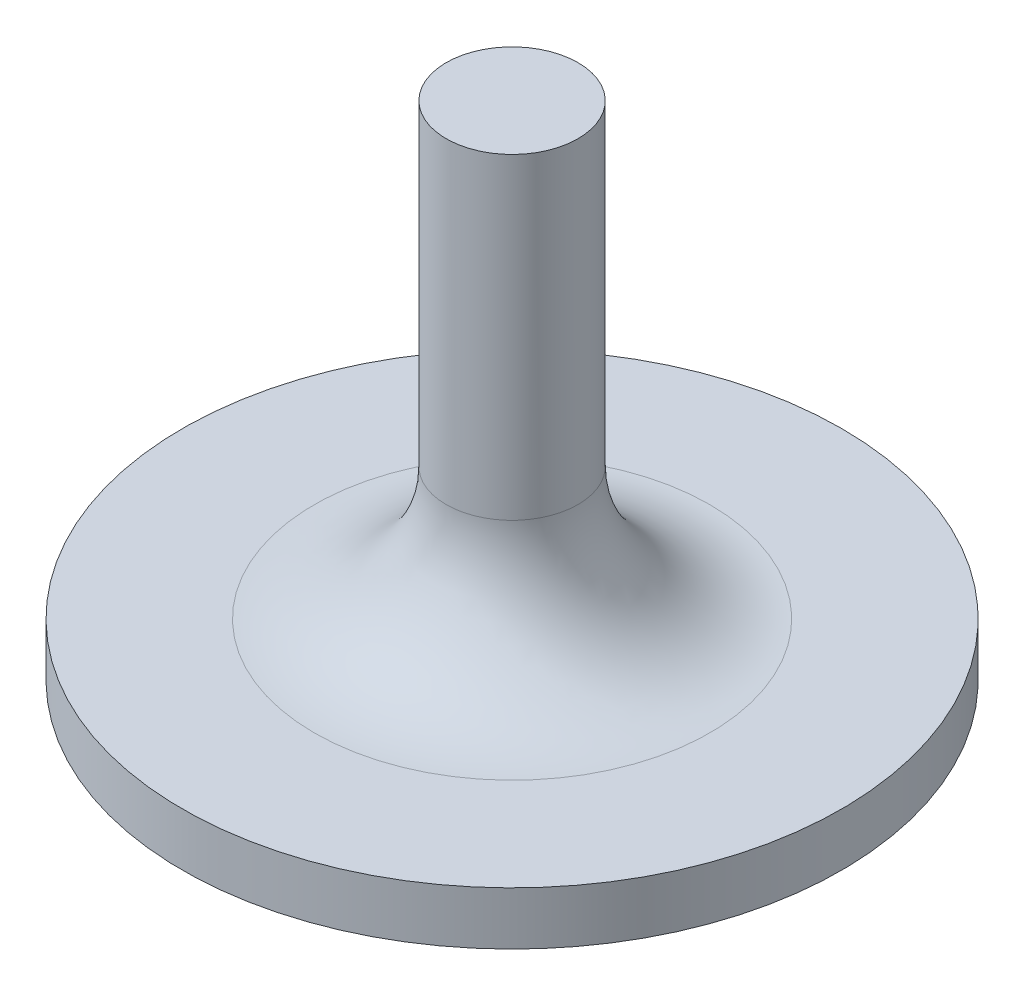
ISO-10303-21;
HEADER;
FILE_DESCRIPTION(('STEP AP214'),'2;1');
FILE_NAME('part.step','',(''),(''),'','','');
FILE_SCHEMA(('AUTOMOTIVE_DESIGN { 1 0 10303 214 1 1 1 1 }'));
ENDSEC;
DATA;
#1=APPLICATION_CONTEXT('core data for automotive mechanical design processes');
#2=APPLICATION_PROTOCOL_DEFINITION('international standard','automotive_design',2000,#1);
#3=PRODUCT_CONTEXT('',#1,'mechanical');
#4=PRODUCT('Part','Part','',(#3));
#5=PRODUCT_RELATED_PRODUCT_CATEGORY('part','',(#4));
#6=PRODUCT_DEFINITION_FORMATION('','',#4);
#7=PRODUCT_DEFINITION_CONTEXT('part definition',#1,'design');
#8=PRODUCT_DEFINITION('design','',#6,#7);
#9=PRODUCT_DEFINITION_SHAPE('','',#8);
#10=(LENGTH_UNIT() NAMED_UNIT(*) SI_UNIT(.MILLI.,.METRE.));
#11=(NAMED_UNIT(*) PLANE_ANGLE_UNIT() SI_UNIT($,.RADIAN.));
#12=(NAMED_UNIT(*) SI_UNIT($,.STERADIAN.) SOLID_ANGLE_UNIT());
#13=UNCERTAINTY_MEASURE_WITH_UNIT(LENGTH_MEASURE(1.E-05),#10,'distance_accuracy_value','');
#14=(GEOMETRIC_REPRESENTATION_CONTEXT(3) GLOBAL_UNCERTAINTY_ASSIGNED_CONTEXT((#13)) GLOBAL_UNIT_ASSIGNED_CONTEXT((#10,
#11,#12)) REPRESENTATION_CONTEXT('',''));
#15=CARTESIAN_POINT('',(0.,0.,0.));
#16=DIRECTION('',(0.,0.,1.));
#17=DIRECTION('',(1.,0.,0.));
#18=AXIS2_PLACEMENT_3D('',#15,#16,#17);
#19=CARTESIAN_POINT('',(0.,50.,0.));
#20=DIRECTION('',(0.,1.,0.));
#21=DIRECTION('',(0.,0.,1.));
#22=AXIS2_PLACEMENT_3D('',#19,#20,#21);
#23=PLANE('',#22);
#24=CARTESIAN_POINT('',(0.,50.,0.));
#25=DIRECTION('',(0.,-1.,0.));
#26=DIRECTION('',(0.,0.,-1.));
#27=AXIS2_PLACEMENT_3D('',#24,#25,#26);
#28=CIRCLE('',#27,5.);
#29=CARTESIAN_POINT('',(0.,50.,-5.));
#30=VERTEX_POINT('',#29);
#31=EDGE_CURVE('E93',#30,#30,#28,.T.);
#32=ORIENTED_EDGE('',*,*,#31,.F.);
#33=EDGE_LOOP('',(#32));
#34=FACE_BOUND('',#33,.T.);
#35=ADVANCED_FACE('F39',(#34),#23,.T.);
#36=CARTESIAN_POINT('',(0.,0.,0.));
#37=DIRECTION('',(0.,-1.,0.));
#38=DIRECTION('',(0.,0.,-1.));
#39=AXIS2_PLACEMENT_3D('',#36,#37,#38);
#40=CYLINDRICAL_SURFACE('',#39,5.);
#41=CARTESIAN_POINT('',(0.,25.9649935669677,0.));
#42=DIRECTION('',(0.,1.,0.));
#43=DIRECTION('',(0.,0.,1.));
#44=AXIS2_PLACEMENT_3D('',#41,#42,#43);
#45=CIRCLE('',#44,5.);
#46=CARTESIAN_POINT('',(0.,25.9649935669677,5.));
#47=VERTEX_POINT('',#46);
#48=EDGE_CURVE('E11',#47,#47,#45,.T.);
#49=ORIENTED_EDGE('',*,*,#48,.T.);
#50=EDGE_LOOP('',(#49));
#51=FACE_BOUND('',#50,.T.);
#52=ORIENTED_EDGE('',*,*,#31,.T.);
#53=EDGE_LOOP('',(#52));
#54=FACE_BOUND('',#53,.T.);
#55=ADVANCED_FACE('F65',(#51,#54),#40,.T.);
#56=CARTESIAN_POINT('',(0.,15.9649935669677,-5.));
#57=DIRECTION('',(0.,1.,0.));
#58=DIRECTION('',(0.,0.,1.));
#59=AXIS2_PLACEMENT_3D('',#56,#57,#58);
#60=PLANE('',#59);
#61=CARTESIAN_POINT('',(0.,15.9649935669677,0.));
#62=DIRECTION('',(0.,1.,0.));
#63=DIRECTION('',(0.,0.,1.));
#64=AXIS2_PLACEMENT_3D('',#61,#62,#63);
#65=CIRCLE('',#64,15.);
#66=CARTESIAN_POINT('',(0.,15.9649935669677,15.));
#67=VERTEX_POINT('',#66);
#68=EDGE_CURVE('E46',#67,#67,#65,.F.);
#69=ORIENTED_EDGE('',*,*,#68,.T.);
#70=EDGE_LOOP('',(#69));
#71=FACE_BOUND('',#70,.T.);
#72=CARTESIAN_POINT('',(0.,15.9649935669677,0.));
#73=DIRECTION('',(0.,-1.,0.));
#74=DIRECTION('',(0.,0.,-1.));
#75=AXIS2_PLACEMENT_3D('',#72,#73,#74);
#76=CIRCLE('',#75,25.);
#77=CARTESIAN_POINT('',(0.,15.9649935669677,-25.));
#78=VERTEX_POINT('',#77);
#79=EDGE_CURVE('E86',#78,#78,#76,.T.);
#80=ORIENTED_EDGE('',*,*,#79,.F.);
#81=EDGE_LOOP('',(#80));
#82=FACE_BOUND('',#81,.T.);
#83=ADVANCED_FACE('F71',(#71,#82),#60,.T.);
#84=CARTESIAN_POINT('',(0.,0.,0.));
#85=DIRECTION('',(0.,-1.,0.));
#86=DIRECTION('',(0.,0.,-1.));
#87=AXIS2_PLACEMENT_3D('',#84,#85,#86);
#88=CYLINDRICAL_SURFACE('',#87,25.);
#89=ORIENTED_EDGE('',*,*,#79,.T.);
#90=EDGE_LOOP('',(#89));
#91=FACE_BOUND('',#90,.T.);
#92=CARTESIAN_POINT('',(0.,11.9418935702953,0.));
#93=DIRECTION('',(0.,-1.,0.));
#94=DIRECTION('',(0.,0.,-1.));
#95=AXIS2_PLACEMENT_3D('',#92,#93,#94);
#96=CIRCLE('',#95,25.);
#97=CARTESIAN_POINT('',(0.,11.9418935702953,-25.));
#98=VERTEX_POINT('',#97);
#99=EDGE_CURVE('E89',#98,#98,#96,.T.);
#100=ORIENTED_EDGE('',*,*,#99,.F.);
#101=EDGE_LOOP('',(#100));
#102=FACE_BOUND('',#101,.T.);
#103=ADVANCED_FACE('F60',(#91,#102),#88,.T.);
#104=CARTESIAN_POINT('',(0.,11.9418935702953,-25.));
#105=DIRECTION('',(0.,-1.,0.));
#106=DIRECTION('',(0.,0.,-1.));
#107=AXIS2_PLACEMENT_3D('',#104,#105,#106);
#108=PLANE('',#107);
#109=CARTESIAN_POINT('',(0.,11.9418935702953,0.));
#110=DIRECTION('',(0.,-1.,0.));
#111=DIRECTION('',(0.,0.,-1.));
#112=AXIS2_PLACEMENT_3D('',#109,#110,#111);
#113=CIRCLE('',#112,12.712399892066);
#114=CARTESIAN_POINT('',(0.,11.9418935702953,-12.712399892066));
#115=VERTEX_POINT('',#114);
#116=EDGE_CURVE('E99',#115,#115,#113,.F.);
#117=ORIENTED_EDGE('',*,*,#116,.T.);
#118=EDGE_LOOP('',(#117));
#119=FACE_BOUND('',#118,.T.);
#120=ORIENTED_EDGE('',*,*,#99,.T.);
#121=EDGE_LOOP('',(#120));
#122=FACE_BOUND('',#121,.T.);
#123=ADVANCED_FACE('F52',(#119,#122),#108,.T.);
#124=CARTESIAN_POINT('',(0.,0.,0.));
#125=DIRECTION('',(0.,1.,0.));
#126=DIRECTION('',(0.,0.,1.));
#127=AXIS2_PLACEMENT_3D('',#124,#125,#126);
#128=CONICAL_SURFACE('',#127,0.,0.436332312998576);
#129=CARTESIAN_POINT('',(0.,10.722534602548,0.));
#130=DIRECTION('',(0.,-1.,0.));
#131=DIRECTION('',(0.,0.,-1.));
#132=AXIS2_PLACEMENT_3D('',#129,#130,#131);
#133=CIRCLE('',#132,5.);
#134=CARTESIAN_POINT('',(0.,10.722534602548,-5.));
#135=VERTEX_POINT('',#134);
#136=EDGE_CURVE('E91',#135,#135,#133,.T.);
#137=ORIENTED_EDGE('',*,*,#136,.T.);
#138=EDGE_LOOP('',(#137));
#139=FACE_BOUND('',#138,.T.);
#140=CARTESIAN_POINT('',(0.,0.,0.));
#141=VERTEX_POINT('',#140);
#142=VERTEX_LOOP('',#141);
#143=FACE_BOUND('',#142,.T.);
#144=ADVANCED_FACE('F49',(#139,#143),#128,.T.);
#145=CARTESIAN_POINT('',(0.,-13.0581064297047,0.));
#146=DIRECTION('',(0.,-1.,0.));
#147=DIRECTION('',(0.,0.,-1.));
#148=AXIS2_PLACEMENT_3D('',#145,#146,#147);
#149=DEGENERATE_TOROIDAL_SURFACE('',#148,12.712399892066,25.,.T.);
#150=ORIENTED_EDGE('',*,*,#116,.F.);
#151=EDGE_LOOP('',(#150));
#152=FACE_BOUND('',#151,.T.);
#153=ORIENTED_EDGE('',*,*,#136,.F.);
#154=EDGE_LOOP('',(#153));
#155=FACE_BOUND('',#154,.T.);
#156=ADVANCED_FACE('F51',(#152,#155),#149,.F.);
#157=CARTESIAN_POINT('',(0.,25.9649935669677,0.));
#158=DIRECTION('',(0.,1.,0.));
#159=DIRECTION('',(0.,0.,1.));
#160=AXIS2_PLACEMENT_3D('',#157,#158,#159);
#161=TOROIDAL_SURFACE('',#160,15.,10.);
#162=ORIENTED_EDGE('',*,*,#48,.F.);
#163=EDGE_LOOP('',(#162));
#164=FACE_BOUND('',#163,.T.);
#165=ORIENTED_EDGE('',*,*,#68,.F.);
#166=EDGE_LOOP('',(#165));
#167=FACE_BOUND('',#166,.T.);
#168=ADVANCED_FACE('F41',(#164,#167),#161,.F.);
#169=CLOSED_SHELL('',(#35,#55,#83,#103,#123,#144,#156,#168));
#170=MANIFOLD_SOLID_BREP('B2',#169);
#171=ADVANCED_BREP_SHAPE_REPRESENTATION('',(#18,#170),#14);
#172=SHAPE_DEFINITION_REPRESENTATION(#9,#171);
ENDSEC;
END-ISO-10303-21;
